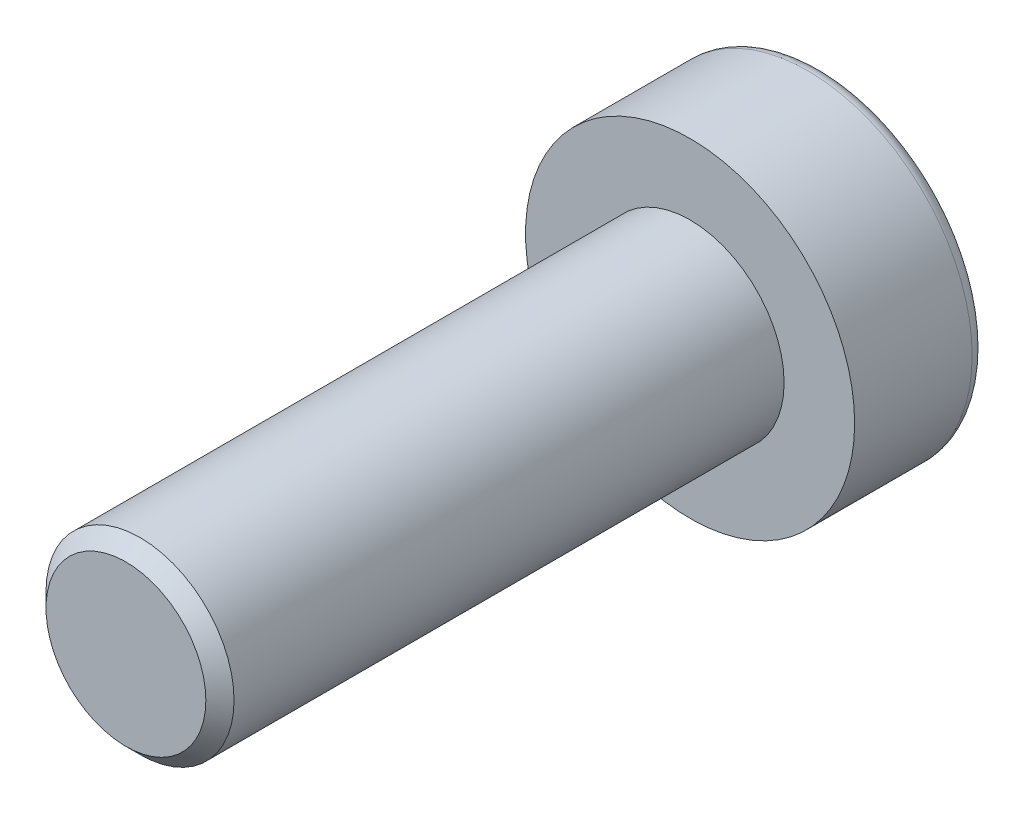
ISO-10303-21;
HEADER;
FILE_DESCRIPTION(('STEP AP214'),'2;1');
FILE_NAME('part.step','',(''),(''),'','','');
FILE_SCHEMA(('AUTOMOTIVE_DESIGN { 1 0 10303 214 1 1 1 1 }'));
ENDSEC;
DATA;
#1=APPLICATION_CONTEXT('core data for automotive mechanical design processes');
#2=APPLICATION_PROTOCOL_DEFINITION('international standard','automotive_design',2000,#1);
#3=PRODUCT_CONTEXT('',#1,'mechanical');
#4=PRODUCT('Part','Part','',(#3));
#5=PRODUCT_RELATED_PRODUCT_CATEGORY('part','',(#4));
#6=PRODUCT_DEFINITION_FORMATION('','',#4);
#7=PRODUCT_DEFINITION_CONTEXT('part definition',#1,'design');
#8=PRODUCT_DEFINITION('design','',#6,#7);
#9=PRODUCT_DEFINITION_SHAPE('','',#8);
#10=(LENGTH_UNIT() NAMED_UNIT(*) SI_UNIT(.MILLI.,.METRE.));
#11=(NAMED_UNIT(*) PLANE_ANGLE_UNIT() SI_UNIT($,.RADIAN.));
#12=(NAMED_UNIT(*) SI_UNIT($,.STERADIAN.) SOLID_ANGLE_UNIT());
#13=UNCERTAINTY_MEASURE_WITH_UNIT(LENGTH_MEASURE(1.E-05),#10,'distance_accuracy_value','');
#14=(GEOMETRIC_REPRESENTATION_CONTEXT(3) GLOBAL_UNCERTAINTY_ASSIGNED_CONTEXT((#13)) GLOBAL_UNIT_ASSIGNED_CONTEXT((#10,
#11,#12)) REPRESENTATION_CONTEXT('',''));
#15=CARTESIAN_POINT('',(0.,0.,0.));
#16=DIRECTION('',(0.,0.,1.));
#17=DIRECTION('',(1.,0.,0.));
#18=AXIS2_PLACEMENT_3D('',#15,#16,#17);
#19=CARTESIAN_POINT('',(0.,0.,2.8));
#20=DIRECTION('',(0.,0.,1.));
#21=DIRECTION('',(1.,0.,0.));
#22=AXIS2_PLACEMENT_3D('',#19,#20,#21);
#23=PLANE('',#22);
#24=CARTESIAN_POINT('',(0.,0.,2.8));
#25=DIRECTION('',(0.,0.,1.));
#26=DIRECTION('',(1.,0.,0.));
#27=AXIS2_PLACEMENT_3D('',#24,#25,#26);
#28=CIRCLE('',#27,3.5);
#29=CARTESIAN_POINT('',(3.5,0.,2.8));
#30=VERTEX_POINT('',#29);
#31=EDGE_CURVE('E126',#30,#30,#28,.T.);
#32=ORIENTED_EDGE('',*,*,#31,.T.);
#33=EDGE_LOOP('',(#32));
#34=FACE_BOUND('',#33,.T.);
#35=CARTESIAN_POINT('',(0.,0.,2.8));
#36=DIRECTION('',(0.,0.,1.));
#37=DIRECTION('',(1.,0.,0.));
#38=AXIS2_PLACEMENT_3D('',#35,#36,#37);
#39=CIRCLE('',#38,2.);
#40=CARTESIAN_POINT('',(2.,0.,2.8));
#41=VERTEX_POINT('',#40);
#42=EDGE_CURVE('E118',#41,#41,#39,.T.);
#43=ORIENTED_EDGE('',*,*,#42,.F.);
#44=EDGE_LOOP('',(#43));
#45=FACE_BOUND('',#44,.T.);
#46=ADVANCED_FACE('F17',(#34,#45),#23,.T.);
#47=CARTESIAN_POINT('',(0.,0.,2.8));
#48=DIRECTION('',(0.,0.,-1.));
#49=DIRECTION('',(-1.,0.,0.));
#50=AXIS2_PLACEMENT_3D('',#47,#48,#49);
#51=CYLINDRICAL_SURFACE('',#50,3.5);
#52=CARTESIAN_POINT('',(0.,0.,0.3));
#53=DIRECTION('',(0.,0.,1.));
#54=DIRECTION('',(1.,0.,0.));
#55=AXIS2_PLACEMENT_3D('',#52,#53,#54);
#56=CIRCLE('',#55,3.5);
#57=CARTESIAN_POINT('',(3.5,0.,0.3));
#58=VERTEX_POINT('',#57);
#59=EDGE_CURVE('E25',#58,#58,#56,.T.);
#60=ORIENTED_EDGE('',*,*,#59,.T.);
#61=EDGE_LOOP('',(#60));
#62=FACE_BOUND('',#61,.T.);
#63=ORIENTED_EDGE('',*,*,#31,.F.);
#64=EDGE_LOOP('',(#63));
#65=FACE_BOUND('',#64,.T.);
#66=ADVANCED_FACE('F139',(#62,#65),#51,.T.);
#67=CARTESIAN_POINT('',(0.,0.,0.));
#68=DIRECTION('',(0.,0.,1.));
#69=DIRECTION('',(1.,0.,0.));
#70=AXIS2_PLACEMENT_3D('',#67,#68,#69);
#71=PLANE('',#70);
#72=CARTESIAN_POINT('',(0.,0.,0.));
#73=DIRECTION('',(0.,0.,1.));
#74=DIRECTION('',(1.,0.,0.));
#75=AXIS2_PLACEMENT_3D('',#72,#73,#74);
#76=CIRCLE('',#75,3.2);
#77=CARTESIAN_POINT('',(3.2,0.,0.));
#78=VERTEX_POINT('',#77);
#79=EDGE_CURVE('E11',#78,#78,#76,.F.);
#80=ORIENTED_EDGE('',*,*,#79,.T.);
#81=EDGE_LOOP('',(#80));
#82=FACE_BOUND('',#81,.T.);
#83=DIRECTION('',(0.866025403784439,-0.5,0.));
#84=VECTOR('',#83,1.);
#85=CARTESIAN_POINT('',(0.,1.50111069989303,0.));
#86=LINE('',#85,#84);
#87=CARTESIAN_POINT('',(0.,1.50111069989303,0.));
#88=VERTEX_POINT('',#87);
#89=CARTESIAN_POINT('',(1.3,0.750555349946514,0.));
#90=VERTEX_POINT('',#89);
#91=EDGE_CURVE('E106',#88,#90,#86,.T.);
#92=ORIENTED_EDGE('',*,*,#91,.F.);
#93=DIRECTION('',(0.866025403784439,0.5,0.));
#94=VECTOR('',#93,1.);
#95=CARTESIAN_POINT('',(-1.3,0.750555349946514,0.));
#96=LINE('',#95,#94);
#97=CARTESIAN_POINT('',(-1.3,0.750555349946514,0.));
#98=VERTEX_POINT('',#97);
#99=EDGE_CURVE('E32',#98,#88,#96,.T.);
#100=ORIENTED_EDGE('',*,*,#99,.F.);
#101=DIRECTION('',(0.,1.,0.));
#102=VECTOR('',#101,1.);
#103=CARTESIAN_POINT('',(-1.3,-0.750555349946514,0.));
#104=LINE('',#103,#102);
#105=CARTESIAN_POINT('',(-1.3,-0.750555349946514,0.));
#106=VERTEX_POINT('',#105);
#107=EDGE_CURVE('E113',#106,#98,#104,.T.);
#108=ORIENTED_EDGE('',*,*,#107,.F.);
#109=DIRECTION('',(-0.866025403784439,0.5,0.));
#110=VECTOR('',#109,1.);
#111=CARTESIAN_POINT('',(0.,-1.50111069989303,0.));
#112=LINE('',#111,#110);
#113=CARTESIAN_POINT('',(0.,-1.50111069989303,0.));
#114=VERTEX_POINT('',#113);
#115=EDGE_CURVE('E114',#114,#106,#112,.T.);
#116=ORIENTED_EDGE('',*,*,#115,.F.);
#117=DIRECTION('',(-0.866025403784439,-0.5,0.));
#118=VECTOR('',#117,1.);
#119=CARTESIAN_POINT('',(1.3,-0.750555349946514,0.));
#120=LINE('',#119,#118);
#121=CARTESIAN_POINT('',(1.3,-0.750555349946514,0.));
#122=VERTEX_POINT('',#121);
#123=EDGE_CURVE('E79',#122,#114,#120,.T.);
#124=ORIENTED_EDGE('',*,*,#123,.F.);
#125=DIRECTION('',(0.,-1.,0.));
#126=VECTOR('',#125,1.);
#127=CARTESIAN_POINT('',(1.3,0.750555349946514,0.));
#128=LINE('',#127,#126);
#129=EDGE_CURVE('E108',#90,#122,#128,.T.);
#130=ORIENTED_EDGE('',*,*,#129,.F.);
#131=EDGE_LOOP('',(#92,#100,#108,#116,#124,#130));
#132=FACE_BOUND('',#131,.T.);
#133=ADVANCED_FACE('F158',(#82,#132),#71,.F.);
#134=CARTESIAN_POINT('',(0.,0.,14.8));
#135=DIRECTION('',(0.,0.,-1.));
#136=DIRECTION('',(-1.,0.,0.));
#137=AXIS2_PLACEMENT_3D('',#134,#135,#136);
#138=CYLINDRICAL_SURFACE('',#137,2.);
#139=CARTESIAN_POINT('',(0.,0.,14.5));
#140=DIRECTION('',(0.,0.,1.));
#141=DIRECTION('',(1.,0.,0.));
#142=AXIS2_PLACEMENT_3D('',#139,#140,#141);
#143=CIRCLE('',#142,2.);
#144=CARTESIAN_POINT('',(2.,0.,14.5));
#145=VERTEX_POINT('',#144);
#146=EDGE_CURVE('E132',#145,#145,#143,.F.);
#147=ORIENTED_EDGE('',*,*,#146,.T.);
#148=EDGE_LOOP('',(#147));
#149=FACE_BOUND('',#148,.T.);
#150=ORIENTED_EDGE('',*,*,#42,.T.);
#151=EDGE_LOOP('',(#150));
#152=FACE_BOUND('',#151,.T.);
#153=ADVANCED_FACE('F162',(#149,#152),#138,.T.);
#154=CARTESIAN_POINT('',(0.,0.,14.8));
#155=DIRECTION('',(0.,0.,1.));
#156=DIRECTION('',(1.,0.,0.));
#157=AXIS2_PLACEMENT_3D('',#154,#155,#156);
#158=PLANE('',#157);
#159=CARTESIAN_POINT('',(0.,0.,14.8));
#160=DIRECTION('',(0.,0.,1.));
#161=DIRECTION('',(1.,0.,0.));
#162=AXIS2_PLACEMENT_3D('',#159,#160,#161);
#163=CIRCLE('',#162,1.7);
#164=CARTESIAN_POINT('',(1.7,0.,14.8));
#165=VERTEX_POINT('',#164);
#166=EDGE_CURVE('E129',#165,#165,#163,.T.);
#167=ORIENTED_EDGE('',*,*,#166,.T.);
#168=EDGE_LOOP('',(#167));
#169=FACE_BOUND('',#168,.T.);
#170=ADVANCED_FACE('F168',(#169),#158,.T.);
#171=CARTESIAN_POINT('',(0.,0.,14.8));
#172=DIRECTION('',(0.,0.,-1.));
#173=DIRECTION('',(-1.,0.,0.));
#174=AXIS2_PLACEMENT_3D('',#171,#172,#173);
#175=CONICAL_SURFACE('',#174,1.7,0.785398163397446);
#176=ORIENTED_EDGE('',*,*,#146,.F.);
#177=EDGE_LOOP('',(#176));
#178=FACE_BOUND('',#177,.T.);
#179=ORIENTED_EDGE('',*,*,#166,.F.);
#180=EDGE_LOOP('',(#179));
#181=FACE_BOUND('',#180,.T.);
#182=ADVANCED_FACE('F170',(#178,#181),#175,.T.);
#183=CARTESIAN_POINT('',(-1.3,0.750555349946514,2.8));
#184=DIRECTION('',(-0.5,0.866025403784439,0.));
#185=DIRECTION('',(-0.866025403784439,-0.5,0.));
#186=AXIS2_PLACEMENT_3D('',#183,#184,#185);
#187=PLANE('',#186);
#188=ORIENTED_EDGE('',*,*,#99,.T.);
#189=DIRECTION('',(0.,0.,-1.));
#190=VECTOR('',#189,1.);
#191=CARTESIAN_POINT('',(0.,1.50111069989303,2.8));
#192=LINE('',#191,#190);
#193=CARTESIAN_POINT('',(0.,1.50111069989303,2.8));
#194=VERTEX_POINT('',#193);
#195=EDGE_CURVE('E62',#194,#88,#192,.T.);
#196=ORIENTED_EDGE('',*,*,#195,.F.);
#197=DIRECTION('',(0.866025403784439,0.5,0.));
#198=VECTOR('',#197,1.);
#199=CARTESIAN_POINT('',(-1.3,0.750555349946514,2.8));
#200=LINE('',#199,#198);
#201=CARTESIAN_POINT('',(-1.3,0.750555349946514,2.8));
#202=VERTEX_POINT('',#201);
#203=EDGE_CURVE('E117',#202,#194,#200,.T.);
#204=ORIENTED_EDGE('',*,*,#203,.F.);
#205=DIRECTION('',(0.,0.,-1.));
#206=VECTOR('',#205,1.);
#207=CARTESIAN_POINT('',(-1.3,0.750555349946514,2.8));
#208=LINE('',#207,#206);
#209=EDGE_CURVE('E37',#202,#98,#208,.T.);
#210=ORIENTED_EDGE('',*,*,#209,.T.);
#211=EDGE_LOOP('',(#188,#196,#204,#210));
#212=FACE_BOUND('',#211,.T.);
#213=ADVANCED_FACE('F166',(#212),#187,.F.);
#214=CARTESIAN_POINT('',(-1.3,-0.750555349946514,2.8));
#215=DIRECTION('',(-1.,0.,0.));
#216=DIRECTION('',(0.,-1.,0.));
#217=AXIS2_PLACEMENT_3D('',#214,#215,#216);
#218=PLANE('',#217);
#219=ORIENTED_EDGE('',*,*,#107,.T.);
#220=ORIENTED_EDGE('',*,*,#209,.F.);
#221=DIRECTION('',(0.,1.,0.));
#222=VECTOR('',#221,1.);
#223=CARTESIAN_POINT('',(-1.3,-0.750555349946514,2.8));
#224=LINE('',#223,#222);
#225=CARTESIAN_POINT('',(-1.3,-0.750555349946514,2.8));
#226=VERTEX_POINT('',#225);
#227=EDGE_CURVE('E95',#226,#202,#224,.T.);
#228=ORIENTED_EDGE('',*,*,#227,.F.);
#229=DIRECTION('',(0.,0.,-1.));
#230=VECTOR('',#229,1.);
#231=CARTESIAN_POINT('',(-1.3,-0.750555349946514,2.8));
#232=LINE('',#231,#230);
#233=EDGE_CURVE('E81',#226,#106,#232,.T.);
#234=ORIENTED_EDGE('',*,*,#233,.T.);
#235=EDGE_LOOP('',(#219,#220,#228,#234));
#236=FACE_BOUND('',#235,.T.);
#237=ADVANCED_FACE('F179',(#236),#218,.F.);
#238=CARTESIAN_POINT('',(0.,-1.50111069989303,2.8));
#239=DIRECTION('',(-0.5,-0.866025403784439,0.));
#240=DIRECTION('',(0.866025403784439,-0.5,0.));
#241=AXIS2_PLACEMENT_3D('',#238,#239,#240);
#242=PLANE('',#241);
#243=ORIENTED_EDGE('',*,*,#115,.T.);
#244=ORIENTED_EDGE('',*,*,#233,.F.);
#245=DIRECTION('',(-0.866025403784439,0.5,0.));
#246=VECTOR('',#245,1.);
#247=CARTESIAN_POINT('',(0.,-1.50111069989303,2.8));
#248=LINE('',#247,#246);
#249=CARTESIAN_POINT('',(0.,-1.50111069989303,2.8));
#250=VERTEX_POINT('',#249);
#251=EDGE_CURVE('E86',#250,#226,#248,.T.);
#252=ORIENTED_EDGE('',*,*,#251,.F.);
#253=DIRECTION('',(0.,0.,-1.));
#254=VECTOR('',#253,1.);
#255=CARTESIAN_POINT('',(0.,-1.50111069989303,2.8));
#256=LINE('',#255,#254);
#257=EDGE_CURVE('E73',#250,#114,#256,.T.);
#258=ORIENTED_EDGE('',*,*,#257,.T.);
#259=EDGE_LOOP('',(#243,#244,#252,#258));
#260=FACE_BOUND('',#259,.T.);
#261=ADVANCED_FACE('F90',(#260),#242,.F.);
#262=CARTESIAN_POINT('',(1.3,-0.750555349946514,2.8));
#263=DIRECTION('',(0.5,-0.866025403784439,0.));
#264=DIRECTION('',(0.866025403784439,0.5,0.));
#265=AXIS2_PLACEMENT_3D('',#262,#263,#264);
#266=PLANE('',#265);
#267=ORIENTED_EDGE('',*,*,#123,.T.);
#268=ORIENTED_EDGE('',*,*,#257,.F.);
#269=DIRECTION('',(-0.866025403784439,-0.5,0.));
#270=VECTOR('',#269,1.);
#271=CARTESIAN_POINT('',(1.3,-0.750555349946514,2.8));
#272=LINE('',#271,#270);
#273=CARTESIAN_POINT('',(1.3,-0.750555349946514,2.8));
#274=VERTEX_POINT('',#273);
#275=EDGE_CURVE('E80',#274,#250,#272,.T.);
#276=ORIENTED_EDGE('',*,*,#275,.F.);
#277=DIRECTION('',(0.,0.,-1.));
#278=VECTOR('',#277,1.);
#279=CARTESIAN_POINT('',(1.3,-0.750555349946514,2.8));
#280=LINE('',#279,#278);
#281=EDGE_CURVE('E83',#274,#122,#280,.T.);
#282=ORIENTED_EDGE('',*,*,#281,.T.);
#283=EDGE_LOOP('',(#267,#268,#276,#282));
#284=FACE_BOUND('',#283,.T.);
#285=ADVANCED_FACE('F74',(#284),#266,.F.);
#286=CARTESIAN_POINT('',(1.3,0.750555349946514,2.8));
#287=DIRECTION('',(1.,0.,0.));
#288=DIRECTION('',(0.,1.,0.));
#289=AXIS2_PLACEMENT_3D('',#286,#287,#288);
#290=PLANE('',#289);
#291=ORIENTED_EDGE('',*,*,#129,.T.);
#292=ORIENTED_EDGE('',*,*,#281,.F.);
#293=DIRECTION('',(0.,-1.,0.));
#294=VECTOR('',#293,1.);
#295=CARTESIAN_POINT('',(1.3,0.750555349946514,2.8));
#296=LINE('',#295,#294);
#297=CARTESIAN_POINT('',(1.3,0.750555349946514,2.8));
#298=VERTEX_POINT('',#297);
#299=EDGE_CURVE('E98',#298,#274,#296,.T.);
#300=ORIENTED_EDGE('',*,*,#299,.F.);
#301=DIRECTION('',(0.,0.,-1.));
#302=VECTOR('',#301,1.);
#303=CARTESIAN_POINT('',(1.3,0.750555349946514,2.8));
#304=LINE('',#303,#302);
#305=EDGE_CURVE('E124',#298,#90,#304,.T.);
#306=ORIENTED_EDGE('',*,*,#305,.T.);
#307=EDGE_LOOP('',(#291,#292,#300,#306));
#308=FACE_BOUND('',#307,.T.);
#309=ADVANCED_FACE('F226',(#308),#290,.F.);
#310=CARTESIAN_POINT('',(0.,1.50111069989303,2.8));
#311=DIRECTION('',(0.5,0.866025403784439,0.));
#312=DIRECTION('',(-0.866025403784439,0.5,0.));
#313=AXIS2_PLACEMENT_3D('',#310,#311,#312);
#314=PLANE('',#313);
#315=ORIENTED_EDGE('',*,*,#91,.T.);
#316=ORIENTED_EDGE('',*,*,#305,.F.);
#317=DIRECTION('',(0.866025403784439,-0.5,0.));
#318=VECTOR('',#317,1.);
#319=CARTESIAN_POINT('',(0.,1.50111069989303,2.8));
#320=LINE('',#319,#318);
#321=EDGE_CURVE('E99',#194,#298,#320,.T.);
#322=ORIENTED_EDGE('',*,*,#321,.F.);
#323=ORIENTED_EDGE('',*,*,#195,.T.);
#324=EDGE_LOOP('',(#315,#316,#322,#323));
#325=FACE_BOUND('',#324,.T.);
#326=ADVANCED_FACE('F146',(#325),#314,.F.);
#327=CARTESIAN_POINT('',(0.,0.,2.8));
#328=DIRECTION('',(0.,0.,-1.));
#329=DIRECTION('',(-1.,0.,0.));
#330=AXIS2_PLACEMENT_3D('',#327,#328,#329);
#331=PLANE('',#330);
#332=ORIENTED_EDGE('',*,*,#203,.T.);
#333=ORIENTED_EDGE('',*,*,#321,.T.);
#334=ORIENTED_EDGE('',*,*,#299,.T.);
#335=ORIENTED_EDGE('',*,*,#275,.T.);
#336=ORIENTED_EDGE('',*,*,#251,.T.);
#337=ORIENTED_EDGE('',*,*,#227,.T.);
#338=EDGE_LOOP('',(#332,#333,#334,#335,#336,#337));
#339=FACE_BOUND('',#338,.T.);
#340=ADVANCED_FACE('F92',(#339),#331,.T.);
#341=CARTESIAN_POINT('',(0.,0.,0.3));
#342=DIRECTION('',(0.,0.,1.));
#343=DIRECTION('',(1.,0.,0.));
#344=AXIS2_PLACEMENT_3D('',#341,#342,#343);
#345=TOROIDAL_SURFACE('',#344,3.2,0.3);
#346=ORIENTED_EDGE('',*,*,#79,.F.);
#347=EDGE_LOOP('',(#346));
#348=FACE_BOUND('',#347,.T.);
#349=ORIENTED_EDGE('',*,*,#59,.F.);
#350=EDGE_LOOP('',(#349));
#351=FACE_BOUND('',#350,.T.);
#352=ADVANCED_FACE('F19',(#348,#351),#345,.T.);
#353=CLOSED_SHELL('',(#46,#66,#133,#153,#170,#182,#213,#237,#261,#285,#309,#326,#340,#352));
#354=MANIFOLD_SOLID_BREP('B1',#353);
#355=ADVANCED_BREP_SHAPE_REPRESENTATION('',(#18,#354),#14);
#356=SHAPE_DEFINITION_REPRESENTATION(#9,#355);
ENDSEC;
END-ISO-10303-21;
